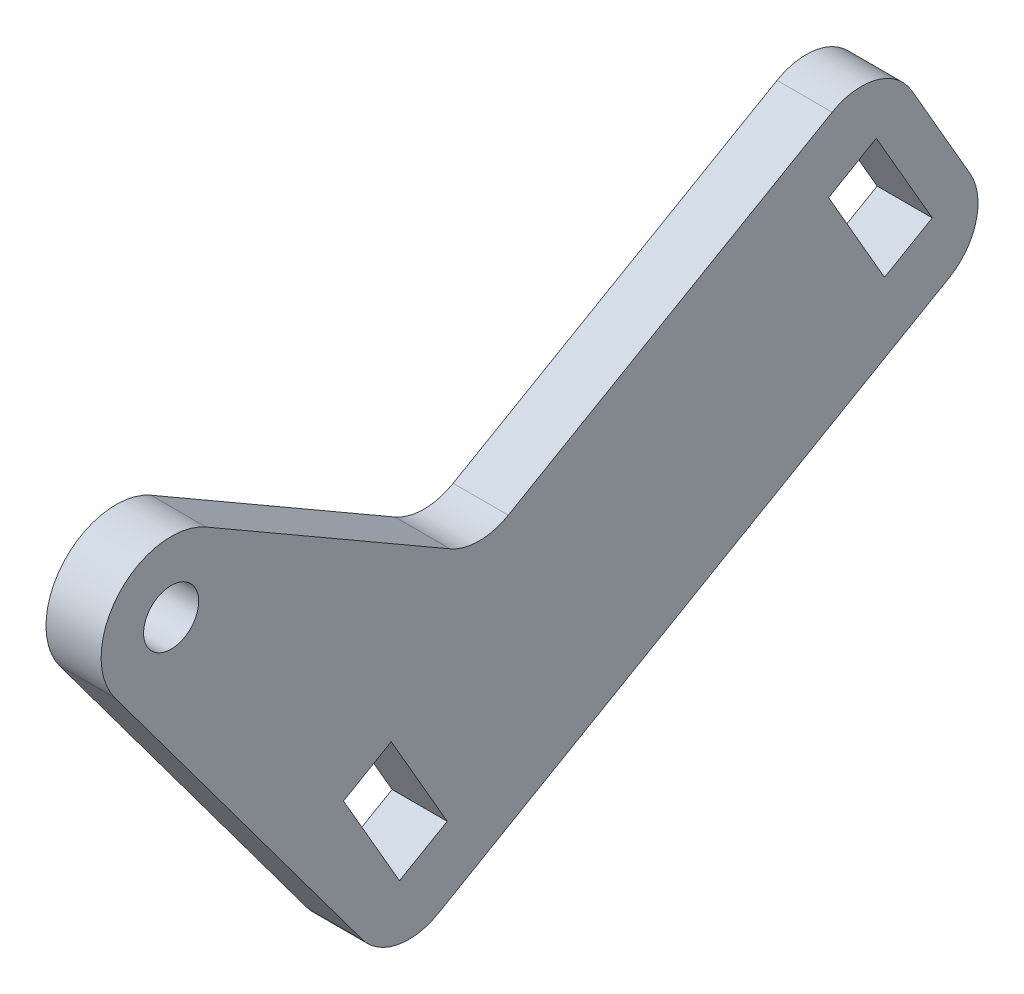
ISO-10303-21;
HEADER;
FILE_DESCRIPTION(('STEP AP214'),'2;1');
FILE_NAME('part.step','',(''),(''),'','','');
FILE_SCHEMA(('AUTOMOTIVE_DESIGN { 1 0 10303 214 1 1 1 1 }'));
ENDSEC;
DATA;
#1=APPLICATION_CONTEXT('core data for automotive mechanical design processes');
#2=APPLICATION_PROTOCOL_DEFINITION('international standard','automotive_design',2000,#1);
#3=PRODUCT_CONTEXT('',#1,'mechanical');
#4=PRODUCT('Part','Part','',(#3));
#5=PRODUCT_RELATED_PRODUCT_CATEGORY('part','',(#4));
#6=PRODUCT_DEFINITION_FORMATION('','',#4);
#7=PRODUCT_DEFINITION_CONTEXT('part definition',#1,'design');
#8=PRODUCT_DEFINITION('design','',#6,#7);
#9=PRODUCT_DEFINITION_SHAPE('','',#8);
#10=(LENGTH_UNIT() NAMED_UNIT(*) SI_UNIT(.MILLI.,.METRE.));
#11=(NAMED_UNIT(*) PLANE_ANGLE_UNIT() SI_UNIT($,.RADIAN.));
#12=(NAMED_UNIT(*) SI_UNIT($,.STERADIAN.) SOLID_ANGLE_UNIT());
#13=UNCERTAINTY_MEASURE_WITH_UNIT(LENGTH_MEASURE(1.E-05),#10,'distance_accuracy_value','');
#14=(GEOMETRIC_REPRESENTATION_CONTEXT(3) GLOBAL_UNCERTAINTY_ASSIGNED_CONTEXT((#13)) GLOBAL_UNIT_ASSIGNED_CONTEXT((#10,
#11,#12)) REPRESENTATION_CONTEXT('',''));
#15=CARTESIAN_POINT('',(0.,0.,0.));
#16=DIRECTION('',(0.,0.,1.));
#17=DIRECTION('',(1.,0.,0.));
#18=AXIS2_PLACEMENT_3D('',#15,#16,#17);
#19=CARTESIAN_POINT('',(1.499997,-4.02573868596873,19.6727839420936));
#20=DIRECTION('',(0.,-0.866025403784438,-0.500000000000001));
#21=DIRECTION('',(0.,0.500000000000001,-0.866025403784438));
#22=AXIS2_PLACEMENT_3D('',#19,#20,#21);
#23=PLANE('',#22);
#24=DIRECTION('',(0.,-0.500000000000001,0.866025403784438));
#25=VECTOR('',#24,1.);
#26=CARTESIAN_POINT('',(-1.499997,-4.02573868596873,19.6727839420936));
#27=LINE('',#26,#25);
#28=CARTESIAN_POINT('',(-1.499997,13.4367613140313,-10.5731532850779));
#29=VERTEX_POINT('',#28);
#30=CARTESIAN_POINT('',(-1.499997,3.26007386859692,7.0533864231627));
#31=VERTEX_POINT('',#30);
#32=EDGE_CURVE('E301',#29,#31,#27,.T.);
#33=ORIENTED_EDGE('',*,*,#32,.T.);
#34=DIRECTION('',(1.,0.,0.));
#35=VECTOR('',#34,1.);
#36=CARTESIAN_POINT('',(1.499997,3.26007386859692,7.0533864231627));
#37=LINE('',#36,#35);
#38=CARTESIAN_POINT('',(1.499997,3.26007386859692,7.0533864231627));
#39=VERTEX_POINT('',#38);
#40=EDGE_CURVE('E334',#31,#39,#37,.T.);
#41=ORIENTED_EDGE('',*,*,#40,.T.);
#42=DIRECTION('',(0.,-0.500000000000001,0.866025403784438));
#43=VECTOR('',#42,1.);
#44=CARTESIAN_POINT('',(1.499997,-4.02573868596873,19.6727839420936));
#45=LINE('',#44,#43);
#46=CARTESIAN_POINT('',(1.499997,13.4367613140313,-10.5731532850779));
#47=VERTEX_POINT('',#46);
#48=EDGE_CURVE('E304',#47,#39,#45,.T.);
#49=ORIENTED_EDGE('',*,*,#48,.F.);
#50=DIRECTION('',(-1.,0.,0.));
#51=VECTOR('',#50,1.);
#52=CARTESIAN_POINT('',(1.499997,13.4367613140313,-10.5731532850779));
#53=LINE('',#52,#51);
#54=EDGE_CURVE('E337',#47,#29,#53,.T.);
#55=ORIENTED_EDGE('',*,*,#54,.T.);
#56=EDGE_LOOP('',(#33,#41,#49,#55));
#57=FACE_BOUND('',#56,.T.);
#58=ADVANCED_FACE('F48',(#57),#23,.F.);
#59=CARTESIAN_POINT('',(1.499997,0.,0.));
#60=DIRECTION('',(-1.,0.,0.));
#61=DIRECTION('',(0.,0.,1.));
#62=AXIS2_PLACEMENT_3D('',#59,#60,#61);
#63=PLANE('',#62);
#64=DIRECTION('',(0.,0.866025403784438,0.500000000000001));
#65=VECTOR('',#64,1.);
#66=CARTESIAN_POINT('',(1.499997,15.0242613140313,-13.3227839420935));
#67=LINE('',#66,#65);
#68=CARTESIAN_POINT('',(1.499997,6.77536934298453,-18.0852839420935));
#69=VERTEX_POINT('',#68);
#70=CARTESIAN_POINT('',(1.499997,12.2746306570157,-14.9102839420935));
#71=VERTEX_POINT('',#70);
#72=EDGE_CURVE('E300',#69,#71,#67,.T.);
#73=ORIENTED_EDGE('',*,*,#72,.T.);
#74=CARTESIAN_POINT('',(1.499997,10.6871306570157,-12.1606532850779));
#75=DIRECTION('',(-1.,0.,0.));
#76=DIRECTION('',(0.,0.,1.));
#77=AXIS2_PLACEMENT_3D('',#74,#75,#76);
#78=CIRCLE('',#77,3.175);
#79=EDGE_CURVE('E316',#71,#47,#78,.F.);
#80=ORIENTED_EDGE('',*,*,#79,.T.);
#81=ORIENTED_EDGE('',*,*,#48,.T.);
#82=CARTESIAN_POINT('',(1.499997,6.00970452561251,8.6408864231627));
#83=DIRECTION('',(-1.,0.,0.));
#84=DIRECTION('',(0.,0.,1.));
#85=AXIS2_PLACEMENT_3D('',#82,#83,#84);
#86=CIRCLE('',#85,3.175);
#87=CARTESIAN_POINT('',(1.499997,3.26007386859693,10.2283864231627));
#88=VERTEX_POINT('',#87);
#89=EDGE_CURVE('E56',#39,#88,#86,.T.);
#90=ORIENTED_EDGE('',*,*,#89,.T.);
#91=DIRECTION('',(0.,-0.500000000000001,-0.866025403784438));
#92=VECTOR('',#91,1.);
#93=CARTESIAN_POINT('',(1.499997,-1.98396583964369,1.14544321158131));
#94=LINE('',#93,#92);
#95=CARTESIAN_POINT('',(1.499997,10.9195567884187,23.495));
#96=VERTEX_POINT('',#95);
#97=EDGE_CURVE('E183',#96,#88,#94,.T.);
#98=ORIENTED_EDGE('',*,*,#97,.F.);
#99=CARTESIAN_POINT('',(1.499997,7.62,25.4));
#100=DIRECTION('',(1.,0.,0.));
#101=DIRECTION('',(0.,0.,-1.));
#102=AXIS2_PLACEMENT_3D('',#99,#100,#101);
#103=CIRCLE('',#102,3.81);
#104=CARTESIAN_POINT('',(1.499997,5.34781342180019,28.4583113238924));
#105=VERTEX_POINT('',#104);
#106=EDGE_CURVE('E189',#96,#105,#103,.T.);
#107=ORIENTED_EDGE('',*,*,#106,.T.);
#108=DIRECTION('',(0.,0.802706384223733,0.596374429973704));
#109=VECTOR('',#108,1.);
#110=CARTESIAN_POINT('',(1.499997,-11.7213631105873,15.7766874765034));
#111=LINE('',#110,#109);
#112=CARTESIAN_POINT('',(1.499997,-12.7539738074901,15.0095045714544));
#113=VERTEX_POINT('',#112);
#114=EDGE_CURVE('E173',#113,#105,#111,.T.);
#115=ORIENTED_EDGE('',*,*,#114,.F.);
#116=CARTESIAN_POINT('',(1.499997,-10.8604849923236,12.460911801544));
#117=DIRECTION('',(-1.,0.,0.));
#118=DIRECTION('',(0.,0.,1.));
#119=AXIS2_PLACEMENT_3D('',#116,#117,#118);
#120=CIRCLE('',#119,3.175);
#121=CARTESIAN_POINT('',(1.499997,-13.6101156493392,10.873411801544));
#122=VERTEX_POINT('',#121);
#123=EDGE_CURVE('E70',#113,#122,#120,.F.);
#124=ORIENTED_EDGE('',*,*,#123,.T.);
#125=DIRECTION('',(0.,0.500000000000001,-0.866025403784438));
#126=VECTOR('',#125,1.);
#127=CARTESIAN_POINT('',(1.499997,4.02573868596894,-19.6727839420935));
#128=LINE('',#127,#126);
#129=CARTESIAN_POINT('',(1.499997,2.43823868596893,-16.9231532850779));
#130=VERTEX_POINT('',#129);
#131=EDGE_CURVE('E297',#122,#130,#128,.T.);
#132=ORIENTED_EDGE('',*,*,#131,.T.);
#133=CARTESIAN_POINT('',(1.499997,5.18786934298452,-15.3356532850779));
#134=DIRECTION('',(-1.,0.,0.));
#135=DIRECTION('',(0.,0.,1.));
#136=AXIS2_PLACEMENT_3D('',#133,#134,#135);
#137=CIRCLE('',#136,3.175);
#138=EDGE_CURVE('E318',#130,#69,#137,.F.);
#139=ORIENTED_EDGE('',*,*,#138,.T.);
#140=EDGE_LOOP('',(#73,#80,#81,#90,#98,#107,#115,#124,#132,#139));
#141=FACE_BOUND('',#140,.T.);
#142=DIRECTION('',(0.,-0.5,0.866025403784439));
#143=VECTOR('',#142,1.);
#144=CARTESIAN_POINT('',(1.499997,-5.73035456926496,16.0212652593516));
#145=LINE('',#144,#143);
#146=CARTESIAN_POINT('',(1.499997,-4.23035456926496,13.4231890479982));
#147=VERTEX_POINT('',#146);
#148=CARTESIAN_POINT('',(1.499997,-5.73035456926496,16.0212652593516));
#149=VERTEX_POINT('',#148);
#150=EDGE_CURVE('E264',#147,#149,#145,.T.);
#151=ORIENTED_EDGE('',*,*,#150,.F.);
#152=DIRECTION('',(0.,0.866025403784439,0.5));
#153=VECTOR('',#152,1.);
#154=CARTESIAN_POINT('',(1.499997,-4.23035456926496,13.4231890479982));
#155=LINE('',#154,#153);
#156=CARTESIAN_POINT('',(1.499997,-9.5096454307349,10.3751890479982));
#157=VERTEX_POINT('',#156);
#158=EDGE_CURVE('E272',#157,#147,#155,.T.);
#159=ORIENTED_EDGE('',*,*,#158,.F.);
#160=DIRECTION('',(0.,0.5,-0.866025403784439));
#161=VECTOR('',#160,1.);
#162=CARTESIAN_POINT('',(1.499997,-11.0096454307349,12.9732652593516));
#163=LINE('',#162,#161);
#164=CARTESIAN_POINT('',(1.499997,-11.0096454307349,12.9732652593516));
#165=VERTEX_POINT('',#164);
#166=EDGE_CURVE('E276',#165,#157,#163,.T.);
#167=ORIENTED_EDGE('',*,*,#166,.F.);
#168=DIRECTION('',(0.,-0.866025403784439,-0.5));
#169=VECTOR('',#168,1.);
#170=CARTESIAN_POINT('',(1.499997,-5.73035456926496,16.0212652593516));
#171=LINE('',#170,#169);
#172=EDGE_CURVE('E266',#149,#165,#171,.T.);
#173=ORIENTED_EDGE('',*,*,#172,.F.);
#174=EDGE_LOOP('',(#151,#159,#167,#173));
#175=FACE_BOUND('',#174,.T.);
#176=DIRECTION('',(0.,-0.500000000000001,0.866025403784438));
#177=VECTOR('',#176,1.);
#178=CARTESIAN_POINT('',(1.499997,9.5096454307349,-10.3751890479982));
#179=LINE('',#178,#177);
#180=CARTESIAN_POINT('',(1.499997,11.0096454307349,-12.9732652593515));
#181=VERTEX_POINT('',#180);
#182=CARTESIAN_POINT('',(1.499997,9.5096454307349,-10.3751890479982));
#183=VERTEX_POINT('',#182);
#184=EDGE_CURVE('E224',#181,#183,#179,.T.);
#185=ORIENTED_EDGE('',*,*,#184,.F.);
#186=DIRECTION('',(0.,0.866025403784438,0.5));
#187=VECTOR('',#186,1.);
#188=CARTESIAN_POINT('',(1.499997,11.0096454307349,-12.9732652593515));
#189=LINE('',#188,#187);
#190=CARTESIAN_POINT('',(1.499997,5.73035456926497,-16.0212652593515));
#191=VERTEX_POINT('',#190);
#192=EDGE_CURVE('E238',#191,#181,#189,.T.);
#193=ORIENTED_EDGE('',*,*,#192,.F.);
#194=DIRECTION('',(0.,0.5,-0.866025403784439));
#195=VECTOR('',#194,1.);
#196=CARTESIAN_POINT('',(1.499997,4.23035456926497,-13.4231890479982));
#197=LINE('',#196,#195);
#198=CARTESIAN_POINT('',(1.499997,4.23035456926497,-13.4231890479982));
#199=VERTEX_POINT('',#198);
#200=EDGE_CURVE('E242',#199,#191,#197,.T.);
#201=ORIENTED_EDGE('',*,*,#200,.F.);
#202=DIRECTION('',(0.,-0.866025403784439,-0.5));
#203=VECTOR('',#202,1.);
#204=CARTESIAN_POINT('',(1.499997,9.5096454307349,-10.3751890479982));
#205=LINE('',#204,#203);
#206=EDGE_CURVE('E227',#183,#199,#205,.T.);
#207=ORIENTED_EDGE('',*,*,#206,.F.);
#208=EDGE_LOOP('',(#185,#193,#201,#207));
#209=FACE_BOUND('',#208,.T.);
#210=CARTESIAN_POINT('',(1.499997,7.62,25.4));
#211=DIRECTION('',(1.,0.,0.));
#212=DIRECTION('',(0.,0.,-1.));
#213=AXIS2_PLACEMENT_3D('',#210,#211,#212);
#214=CIRCLE('',#213,1.5);
#215=CARTESIAN_POINT('',(1.499997,7.62,23.9));
#216=VERTEX_POINT('',#215);
#217=EDGE_CURVE('E199',#216,#216,#214,.T.);
#218=ORIENTED_EDGE('',*,*,#217,.F.);
#219=EDGE_LOOP('',(#218));
#220=FACE_BOUND('',#219,.T.);
#221=ADVANCED_FACE('F196',(#141,#175,#209,#220),#63,.F.);
#222=CARTESIAN_POINT('',(-1.499997,0.,0.));
#223=DIRECTION('',(-1.,0.,0.));
#224=DIRECTION('',(0.,0.,1.));
#225=AXIS2_PLACEMENT_3D('',#222,#223,#224);
#226=PLANE('',#225);
#227=ORIENTED_EDGE('',*,*,#32,.F.);
#228=CARTESIAN_POINT('',(-1.499997,10.6871306570157,-12.1606532850779));
#229=DIRECTION('',(-1.,0.,0.));
#230=DIRECTION('',(0.,0.,1.));
#231=AXIS2_PLACEMENT_3D('',#228,#229,#230);
#232=CIRCLE('',#231,3.175);
#233=CARTESIAN_POINT('',(-1.499997,12.2746306570157,-14.9102839420935));
#234=VERTEX_POINT('',#233);
#235=EDGE_CURVE('E326',#29,#234,#232,.T.);
#236=ORIENTED_EDGE('',*,*,#235,.T.);
#237=DIRECTION('',(0.,0.866025403784438,0.500000000000001));
#238=VECTOR('',#237,1.);
#239=CARTESIAN_POINT('',(-1.499997,15.0242613140313,-13.3227839420935));
#240=LINE('',#239,#238);
#241=CARTESIAN_POINT('',(-1.499997,6.77536934298453,-18.0852839420935));
#242=VERTEX_POINT('',#241);
#243=EDGE_CURVE('E342',#242,#234,#240,.T.);
#244=ORIENTED_EDGE('',*,*,#243,.F.);
#245=CARTESIAN_POINT('',(-1.499997,5.18786934298452,-15.3356532850779));
#246=DIRECTION('',(-1.,0.,0.));
#247=DIRECTION('',(0.,0.,1.));
#248=AXIS2_PLACEMENT_3D('',#245,#246,#247);
#249=CIRCLE('',#248,3.175);
#250=CARTESIAN_POINT('',(-1.499997,2.43823868596893,-16.9231532850779));
#251=VERTEX_POINT('',#250);
#252=EDGE_CURVE('E328',#242,#251,#249,.T.);
#253=ORIENTED_EDGE('',*,*,#252,.T.);
#254=DIRECTION('',(0.,0.500000000000001,-0.866025403784438));
#255=VECTOR('',#254,1.);
#256=CARTESIAN_POINT('',(-1.499997,4.02573868596894,-19.6727839420935));
#257=LINE('',#256,#255);
#258=CARTESIAN_POINT('',(-1.499997,-13.6101156493392,10.873411801544));
#259=VERTEX_POINT('',#258);
#260=EDGE_CURVE('E296',#259,#251,#257,.T.);
#261=ORIENTED_EDGE('',*,*,#260,.F.);
#262=CARTESIAN_POINT('',(-1.499997,-10.8604849923236,12.460911801544));
#263=DIRECTION('',(-1.,0.,0.));
#264=DIRECTION('',(0.,0.,1.));
#265=AXIS2_PLACEMENT_3D('',#262,#263,#264);
#266=CIRCLE('',#265,3.175);
#267=CARTESIAN_POINT('',(-1.499997,-12.7539738074901,15.0095045714544));
#268=VERTEX_POINT('',#267);
#269=EDGE_CURVE('E330',#259,#268,#266,.T.);
#270=ORIENTED_EDGE('',*,*,#269,.T.);
#271=DIRECTION('',(0.,0.802706384223733,0.596374429973704));
#272=VECTOR('',#271,1.);
#273=CARTESIAN_POINT('',(-1.499997,-11.7213631105873,15.7766874765034));
#274=LINE('',#273,#272);
#275=CARTESIAN_POINT('',(-1.499997,5.34781342180019,28.4583113238924));
#276=VERTEX_POINT('',#275);
#277=EDGE_CURVE('E182',#268,#276,#274,.T.);
#278=ORIENTED_EDGE('',*,*,#277,.T.);
#279=CARTESIAN_POINT('',(-1.499997,7.62,25.4));
#280=DIRECTION('',(1.,0.,0.));
#281=DIRECTION('',(0.,0.,-1.));
#282=AXIS2_PLACEMENT_3D('',#279,#280,#281);
#283=CIRCLE('',#282,3.81);
#284=CARTESIAN_POINT('',(-1.499997,10.9195567884187,23.495));
#285=VERTEX_POINT('',#284);
#286=EDGE_CURVE('E191',#285,#276,#283,.T.);
#287=ORIENTED_EDGE('',*,*,#286,.F.);
#288=DIRECTION('',(0.,-0.500000000000001,-0.866025403784438));
#289=VECTOR('',#288,1.);
#290=CARTESIAN_POINT('',(-1.499997,-1.98396583964369,1.14544321158131));
#291=LINE('',#290,#289);
#292=CARTESIAN_POINT('',(-1.499997,3.26007386859693,10.2283864231627));
#293=VERTEX_POINT('',#292);
#294=EDGE_CURVE('E218',#285,#293,#291,.T.);
#295=ORIENTED_EDGE('',*,*,#294,.T.);
#296=CARTESIAN_POINT('',(-1.499997,6.00970452561251,8.6408864231627));
#297=DIRECTION('',(-1.,0.,0.));
#298=DIRECTION('',(0.,0.,1.));
#299=AXIS2_PLACEMENT_3D('',#296,#297,#298);
#300=CIRCLE('',#299,3.175);
#301=EDGE_CURVE('E12',#293,#31,#300,.F.);
#302=ORIENTED_EDGE('',*,*,#301,.T.);
#303=EDGE_LOOP('',(#227,#236,#244,#253,#261,#270,#278,#287,#295,#302));
#304=FACE_BOUND('',#303,.T.);
#305=DIRECTION('',(0.,0.866025403784439,0.5));
#306=VECTOR('',#305,1.);
#307=CARTESIAN_POINT('',(-1.499997,-4.23035456926496,13.4231890479982));
#308=LINE('',#307,#306);
#309=CARTESIAN_POINT('',(-1.499997,-9.5096454307349,10.3751890479982));
#310=VERTEX_POINT('',#309);
#311=CARTESIAN_POINT('',(-1.499997,-4.23035456926496,13.4231890479982));
#312=VERTEX_POINT('',#311);
#313=EDGE_CURVE('E267',#310,#312,#308,.T.);
#314=ORIENTED_EDGE('',*,*,#313,.T.);
#315=DIRECTION('',(0.,-0.5,0.866025403784439));
#316=VECTOR('',#315,1.);
#317=CARTESIAN_POINT('',(-1.499997,-5.73035456926496,16.0212652593516));
#318=LINE('',#317,#316);
#319=CARTESIAN_POINT('',(-1.499997,-5.73035456926496,16.0212652593516));
#320=VERTEX_POINT('',#319);
#321=EDGE_CURVE('E263',#312,#320,#318,.T.);
#322=ORIENTED_EDGE('',*,*,#321,.T.);
#323=DIRECTION('',(0.,-0.866025403784439,-0.5));
#324=VECTOR('',#323,1.);
#325=CARTESIAN_POINT('',(-1.499997,-5.73035456926496,16.0212652593516));
#326=LINE('',#325,#324);
#327=CARTESIAN_POINT('',(-1.499997,-11.0096454307349,12.9732652593516));
#328=VERTEX_POINT('',#327);
#329=EDGE_CURVE('E280',#320,#328,#326,.T.);
#330=ORIENTED_EDGE('',*,*,#329,.T.);
#331=DIRECTION('',(0.,0.5,-0.866025403784439));
#332=VECTOR('',#331,1.);
#333=CARTESIAN_POINT('',(-1.499997,-11.0096454307349,12.9732652593516));
#334=LINE('',#333,#332);
#335=EDGE_CURVE('E283',#328,#310,#334,.T.);
#336=ORIENTED_EDGE('',*,*,#335,.T.);
#337=EDGE_LOOP('',(#314,#322,#330,#336));
#338=FACE_BOUND('',#337,.T.);
#339=DIRECTION('',(0.,0.866025403784438,0.5));
#340=VECTOR('',#339,1.);
#341=CARTESIAN_POINT('',(-1.499997,11.0096454307349,-12.9732652593515));
#342=LINE('',#341,#340);
#343=CARTESIAN_POINT('',(-1.499997,5.73035456926497,-16.0212652593516));
#344=VERTEX_POINT('',#343);
#345=CARTESIAN_POINT('',(-1.499997,11.0096454307349,-12.9732652593515));
#346=VERTEX_POINT('',#345);
#347=EDGE_CURVE('E228',#344,#346,#342,.T.);
#348=ORIENTED_EDGE('',*,*,#347,.T.);
#349=DIRECTION('',(0.,-0.500000000000001,0.866025403784438));
#350=VECTOR('',#349,1.);
#351=CARTESIAN_POINT('',(-1.499997,9.5096454307349,-10.3751890479982));
#352=LINE('',#351,#350);
#353=CARTESIAN_POINT('',(-1.499997,9.5096454307349,-10.3751890479982));
#354=VERTEX_POINT('',#353);
#355=EDGE_CURVE('E221',#346,#354,#352,.T.);
#356=ORIENTED_EDGE('',*,*,#355,.T.);
#357=DIRECTION('',(0.,-0.866025403784439,-0.5));
#358=VECTOR('',#357,1.);
#359=CARTESIAN_POINT('',(-1.499997,9.5096454307349,-10.3751890479982));
#360=LINE('',#359,#358);
#361=CARTESIAN_POINT('',(-1.499997,4.23035456926497,-13.4231890479982));
#362=VERTEX_POINT('',#361);
#363=EDGE_CURVE('E246',#354,#362,#360,.T.);
#364=ORIENTED_EDGE('',*,*,#363,.T.);
#365=DIRECTION('',(0.,0.5,-0.866025403784439));
#366=VECTOR('',#365,1.);
#367=CARTESIAN_POINT('',(-1.499997,4.23035456926497,-13.4231890479982));
#368=LINE('',#367,#366);
#369=EDGE_CURVE('E249',#362,#344,#368,.T.);
#370=ORIENTED_EDGE('',*,*,#369,.T.);
#371=EDGE_LOOP('',(#348,#356,#364,#370));
#372=FACE_BOUND('',#371,.T.);
#373=CARTESIAN_POINT('',(-1.499997,7.62,25.4));
#374=DIRECTION('',(1.,0.,0.));
#375=DIRECTION('',(0.,0.,-1.));
#376=AXIS2_PLACEMENT_3D('',#373,#374,#375);
#377=CIRCLE('',#376,1.5);
#378=CARTESIAN_POINT('',(-1.499997,7.62,23.9));
#379=VERTEX_POINT('',#378);
#380=EDGE_CURVE('E205',#379,#379,#377,.T.);
#381=ORIENTED_EDGE('',*,*,#380,.T.);
#382=EDGE_LOOP('',(#381));
#383=FACE_BOUND('',#382,.T.);
#384=ADVANCED_FACE('F372',(#304,#338,#372,#383),#226,.T.);
#385=CARTESIAN_POINT('',(1.499997,4.02573868596894,-19.6727839420935));
#386=DIRECTION('',(0.,0.866025403784438,0.500000000000001));
#387=DIRECTION('',(0.,-0.500000000000001,0.866025403784438));
#388=AXIS2_PLACEMENT_3D('',#385,#386,#387);
#389=PLANE('',#388);
#390=ORIENTED_EDGE('',*,*,#260,.T.);
#391=DIRECTION('',(-1.,0.,0.));
#392=VECTOR('',#391,1.);
#393=CARTESIAN_POINT('',(1.499997,2.43823868596893,-16.9231532850779));
#394=LINE('',#393,#392);
#395=EDGE_CURVE('E63',#251,#130,#394,.F.);
#396=ORIENTED_EDGE('',*,*,#395,.T.);
#397=ORIENTED_EDGE('',*,*,#131,.F.);
#398=DIRECTION('',(-1.,0.,0.));
#399=VECTOR('',#398,1.);
#400=CARTESIAN_POINT('',(1.499997,-13.6101156493392,10.873411801544));
#401=LINE('',#400,#399);
#402=EDGE_CURVE('E313',#122,#259,#401,.T.);
#403=ORIENTED_EDGE('',*,*,#402,.T.);
#404=EDGE_LOOP('',(#390,#396,#397,#403));
#405=FACE_BOUND('',#404,.T.);
#406=ADVANCED_FACE('F345',(#405),#389,.F.);
#407=CARTESIAN_POINT('',(1.499997,15.0242613140313,-13.3227839420935));
#408=DIRECTION('',(0.,-0.500000000000001,0.866025403784438));
#409=DIRECTION('',(0.,-0.866025403784438,-0.500000000000001));
#410=AXIS2_PLACEMENT_3D('',#407,#408,#409);
#411=PLANE('',#410);
#412=ORIENTED_EDGE('',*,*,#243,.T.);
#413=DIRECTION('',(-1.,0.,0.));
#414=VECTOR('',#413,1.);
#415=CARTESIAN_POINT('',(1.499997,12.2746306570157,-14.9102839420935));
#416=LINE('',#415,#414);
#417=EDGE_CURVE('E321',#234,#71,#416,.F.);
#418=ORIENTED_EDGE('',*,*,#417,.T.);
#419=ORIENTED_EDGE('',*,*,#72,.F.);
#420=DIRECTION('',(-1.,0.,0.));
#421=VECTOR('',#420,1.);
#422=CARTESIAN_POINT('',(1.499997,6.77536934298453,-18.0852839420935));
#423=LINE('',#422,#421);
#424=EDGE_CURVE('E323',#69,#242,#423,.T.);
#425=ORIENTED_EDGE('',*,*,#424,.T.);
#426=EDGE_LOOP('',(#412,#418,#419,#425));
#427=FACE_BOUND('',#426,.T.);
#428=ADVANCED_FACE('F355',(#427),#411,.F.);
#429=CARTESIAN_POINT('',(1.499997,-5.73035456926496,16.0212652593516));
#430=DIRECTION('',(0.,-0.866025403784439,-0.5));
#431=DIRECTION('',(0.,0.5,-0.866025403784439));
#432=AXIS2_PLACEMENT_3D('',#429,#430,#431);
#433=PLANE('',#432);
#434=ORIENTED_EDGE('',*,*,#321,.F.);
#435=DIRECTION('',(-1.,0.,0.));
#436=VECTOR('',#435,1.);
#437=CARTESIAN_POINT('',(1.499997,-4.23035456926496,13.4231890479982));
#438=LINE('',#437,#436);
#439=EDGE_CURVE('E275',#147,#312,#438,.T.);
#440=ORIENTED_EDGE('',*,*,#439,.F.);
#441=ORIENTED_EDGE('',*,*,#150,.T.);
#442=DIRECTION('',(-1.,0.,0.));
#443=VECTOR('',#442,1.);
#444=CARTESIAN_POINT('',(1.499997,-5.73035456926496,16.0212652593516));
#445=LINE('',#444,#443);
#446=EDGE_CURVE('E294',#149,#320,#445,.T.);
#447=ORIENTED_EDGE('',*,*,#446,.T.);
#448=EDGE_LOOP('',(#434,#440,#441,#447));
#449=FACE_BOUND('',#448,.T.);
#450=ADVANCED_FACE('F399',(#449),#433,.T.);
#451=CARTESIAN_POINT('',(1.499997,-5.73035456926496,16.0212652593516));
#452=DIRECTION('',(0.,0.5,-0.866025403784439));
#453=DIRECTION('',(0.,0.866025403784439,0.5));
#454=AXIS2_PLACEMENT_3D('',#451,#452,#453);
#455=PLANE('',#454);
#456=ORIENTED_EDGE('',*,*,#329,.F.);
#457=ORIENTED_EDGE('',*,*,#446,.F.);
#458=ORIENTED_EDGE('',*,*,#172,.T.);
#459=DIRECTION('',(-1.,0.,0.));
#460=VECTOR('',#459,1.);
#461=CARTESIAN_POINT('',(1.499997,-11.0096454307349,12.9732652593516));
#462=LINE('',#461,#460);
#463=EDGE_CURVE('E292',#165,#328,#462,.T.);
#464=ORIENTED_EDGE('',*,*,#463,.T.);
#465=EDGE_LOOP('',(#456,#457,#458,#464));
#466=FACE_BOUND('',#465,.T.);
#467=ADVANCED_FACE('F495',(#466),#455,.T.);
#468=CARTESIAN_POINT('',(1.499997,-11.0096454307349,12.9732652593516));
#469=DIRECTION('',(0.,0.866025403784439,0.5));
#470=DIRECTION('',(0.,-0.5,0.866025403784439));
#471=AXIS2_PLACEMENT_3D('',#468,#469,#470);
#472=PLANE('',#471);
#473=ORIENTED_EDGE('',*,*,#335,.F.);
#474=ORIENTED_EDGE('',*,*,#463,.F.);
#475=ORIENTED_EDGE('',*,*,#166,.T.);
#476=DIRECTION('',(-1.,0.,0.));
#477=VECTOR('',#476,1.);
#478=CARTESIAN_POINT('',(1.499997,-9.5096454307349,10.3751890479982));
#479=LINE('',#478,#477);
#480=EDGE_CURVE('E290',#157,#310,#479,.T.);
#481=ORIENTED_EDGE('',*,*,#480,.T.);
#482=EDGE_LOOP('',(#473,#474,#475,#481));
#483=FACE_BOUND('',#482,.T.);
#484=ADVANCED_FACE('F505',(#483),#472,.T.);
#485=CARTESIAN_POINT('',(1.499997,-4.23035456926496,13.4231890479982));
#486=DIRECTION('',(0.,-0.5,0.866025403784439));
#487=DIRECTION('',(0.,-0.866025403784439,-0.5));
#488=AXIS2_PLACEMENT_3D('',#485,#486,#487);
#489=PLANE('',#488);
#490=ORIENTED_EDGE('',*,*,#313,.F.);
#491=ORIENTED_EDGE('',*,*,#480,.F.);
#492=ORIENTED_EDGE('',*,*,#158,.T.);
#493=ORIENTED_EDGE('',*,*,#439,.T.);
#494=EDGE_LOOP('',(#490,#491,#492,#493));
#495=FACE_BOUND('',#494,.T.);
#496=ADVANCED_FACE('F515',(#495),#489,.T.);
#497=CARTESIAN_POINT('',(1.499997,9.5096454307349,-10.3751890479982));
#498=DIRECTION('',(0.,-0.866025403784438,-0.500000000000001));
#499=DIRECTION('',(0.,0.500000000000001,-0.866025403784438));
#500=AXIS2_PLACEMENT_3D('',#497,#498,#499);
#501=PLANE('',#500);
#502=ORIENTED_EDGE('',*,*,#355,.F.);
#503=DIRECTION('',(-1.,0.,0.));
#504=VECTOR('',#503,1.);
#505=CARTESIAN_POINT('',(1.499997,11.0096454307349,-12.9732652593515));
#506=LINE('',#505,#504);
#507=EDGE_CURVE('E241',#181,#346,#506,.T.);
#508=ORIENTED_EDGE('',*,*,#507,.F.);
#509=ORIENTED_EDGE('',*,*,#184,.T.);
#510=DIRECTION('',(-1.,0.,0.));
#511=VECTOR('',#510,1.);
#512=CARTESIAN_POINT('',(1.499997,9.5096454307349,-10.3751890479982));
#513=LINE('',#512,#511);
#514=EDGE_CURVE('E260',#183,#354,#513,.T.);
#515=ORIENTED_EDGE('',*,*,#514,.T.);
#516=EDGE_LOOP('',(#502,#508,#509,#515));
#517=FACE_BOUND('',#516,.T.);
#518=ADVANCED_FACE('F525',(#517),#501,.T.);
#519=CARTESIAN_POINT('',(1.499997,9.5096454307349,-10.3751890479982));
#520=DIRECTION('',(0.,0.5,-0.866025403784439));
#521=DIRECTION('',(0.,0.866025403784439,0.5));
#522=AXIS2_PLACEMENT_3D('',#519,#520,#521);
#523=PLANE('',#522);
#524=ORIENTED_EDGE('',*,*,#363,.F.);
#525=ORIENTED_EDGE('',*,*,#514,.F.);
#526=ORIENTED_EDGE('',*,*,#206,.T.);
#527=DIRECTION('',(-1.,0.,0.));
#528=VECTOR('',#527,1.);
#529=CARTESIAN_POINT('',(1.499997,4.23035456926497,-13.4231890479982));
#530=LINE('',#529,#528);
#531=EDGE_CURVE('E258',#199,#362,#530,.T.);
#532=ORIENTED_EDGE('',*,*,#531,.T.);
#533=EDGE_LOOP('',(#524,#525,#526,#532));
#534=FACE_BOUND('',#533,.T.);
#535=ADVANCED_FACE('F535',(#534),#523,.T.);
#536=CARTESIAN_POINT('',(1.499997,4.23035456926497,-13.4231890479982));
#537=DIRECTION('',(0.,0.866025403784439,0.5));
#538=DIRECTION('',(0.,-0.5,0.866025403784439));
#539=AXIS2_PLACEMENT_3D('',#536,#537,#538);
#540=PLANE('',#539);
#541=ORIENTED_EDGE('',*,*,#369,.F.);
#542=ORIENTED_EDGE('',*,*,#531,.F.);
#543=ORIENTED_EDGE('',*,*,#200,.T.);
#544=DIRECTION('',(-1.,0.,0.));
#545=VECTOR('',#544,1.);
#546=CARTESIAN_POINT('',(1.499997,5.73035456926497,-16.0212652593516));
#547=LINE('',#546,#545);
#548=EDGE_CURVE('E256',#191,#344,#547,.T.);
#549=ORIENTED_EDGE('',*,*,#548,.T.);
#550=EDGE_LOOP('',(#541,#542,#543,#549));
#551=FACE_BOUND('',#550,.T.);
#552=ADVANCED_FACE('F545',(#551),#540,.T.);
#553=CARTESIAN_POINT('',(1.499997,11.0096454307349,-12.9732652593515));
#554=DIRECTION('',(0.,-0.5,0.866025403784438));
#555=DIRECTION('',(0.,-0.866025403784439,-0.5));
#556=AXIS2_PLACEMENT_3D('',#553,#554,#555);
#557=PLANE('',#556);
#558=ORIENTED_EDGE('',*,*,#347,.F.);
#559=ORIENTED_EDGE('',*,*,#548,.F.);
#560=ORIENTED_EDGE('',*,*,#192,.T.);
#561=ORIENTED_EDGE('',*,*,#507,.T.);
#562=EDGE_LOOP('',(#558,#559,#560,#561));
#563=FACE_BOUND('',#562,.T.);
#564=ADVANCED_FACE('F444',(#563),#557,.T.);
#565=CARTESIAN_POINT('',(-34.1467736774771,-1.98396583964369,1.14544321158131));
#566=DIRECTION('',(0.,-0.866025403784438,0.500000000000001));
#567=DIRECTION('',(0.,-0.500000000000001,-0.866025403784438));
#568=AXIS2_PLACEMENT_3D('',#565,#566,#567);
#569=PLANE('',#568);
#570=ORIENTED_EDGE('',*,*,#97,.T.);
#571=DIRECTION('',(1.,0.,0.));
#572=VECTOR('',#571,1.);
#573=CARTESIAN_POINT('',(-1.499997,3.26007386859693,10.2283864231627));
#574=LINE('',#573,#572);
#575=EDGE_CURVE('E332',#88,#293,#574,.F.);
#576=ORIENTED_EDGE('',*,*,#575,.T.);
#577=ORIENTED_EDGE('',*,*,#294,.F.);
#578=DIRECTION('',(1.,0.,0.));
#579=VECTOR('',#578,1.);
#580=CARTESIAN_POINT('',(-34.1467736774771,10.9195567884187,23.495));
#581=LINE('',#580,#579);
#582=EDGE_CURVE('E192',#285,#96,#581,.T.);
#583=ORIENTED_EDGE('',*,*,#582,.T.);
#584=EDGE_LOOP('',(#570,#576,#577,#583));
#585=FACE_BOUND('',#584,.T.);
#586=ADVANCED_FACE('F371',(#585),#569,.F.);
#587=CARTESIAN_POINT('',(-34.1467736774771,-11.7213631105873,15.7766874765034));
#588=DIRECTION('',(0.,0.596374429973704,-0.802706384223733));
#589=DIRECTION('',(0.,0.802706384223733,0.596374429973704));
#590=AXIS2_PLACEMENT_3D('',#587,#588,#589);
#591=PLANE('',#590);
#592=ORIENTED_EDGE('',*,*,#277,.F.);
#593=DIRECTION('',(-1.,0.,0.));
#594=VECTOR('',#593,1.);
#595=CARTESIAN_POINT('',(-34.1467736774771,-12.7539738074901,15.0095045714544));
#596=LINE('',#595,#594);
#597=EDGE_CURVE('E180',#268,#113,#596,.F.);
#598=ORIENTED_EDGE('',*,*,#597,.T.);
#599=ORIENTED_EDGE('',*,*,#114,.T.);
#600=DIRECTION('',(1.,0.,0.));
#601=VECTOR('',#600,1.);
#602=CARTESIAN_POINT('',(-34.1467736774771,5.34781342180019,28.4583113238924));
#603=LINE('',#602,#601);
#604=EDGE_CURVE('E177',#276,#105,#603,.T.);
#605=ORIENTED_EDGE('',*,*,#604,.F.);
#606=EDGE_LOOP('',(#592,#598,#599,#605));
#607=FACE_BOUND('',#606,.T.);
#608=ADVANCED_FACE('F176',(#607),#591,.F.);
#609=CARTESIAN_POINT('',(1.499997,7.62,25.4));
#610=DIRECTION('',(-1.,0.,0.));
#611=DIRECTION('',(0.,0.,1.));
#612=AXIS2_PLACEMENT_3D('',#609,#610,#611);
#613=CYLINDRICAL_SURFACE('',#612,1.5);
#614=ORIENTED_EDGE('',*,*,#217,.T.);
#615=EDGE_LOOP('',(#614));
#616=FACE_BOUND('',#615,.T.);
#617=ORIENTED_EDGE('',*,*,#380,.F.);
#618=EDGE_LOOP('',(#617));
#619=FACE_BOUND('',#618,.T.);
#620=ADVANCED_FACE('F378',(#616,#619),#613,.F.);
#621=CARTESIAN_POINT('',(1.499997,7.62,25.4));
#622=DIRECTION('',(-1.,0.,0.));
#623=DIRECTION('',(0.,0.,1.));
#624=AXIS2_PLACEMENT_3D('',#621,#622,#623);
#625=CYLINDRICAL_SURFACE('',#624,3.81);
#626=ORIENTED_EDGE('',*,*,#582,.F.);
#627=ORIENTED_EDGE('',*,*,#286,.T.);
#628=ORIENTED_EDGE('',*,*,#604,.T.);
#629=ORIENTED_EDGE('',*,*,#106,.F.);
#630=EDGE_LOOP('',(#626,#627,#628,#629));
#631=FACE_BOUND('',#630,.T.);
#632=ADVANCED_FACE('F188',(#631),#625,.T.);
#633=CARTESIAN_POINT('',(1.499997,6.00970452561251,8.6408864231627));
#634=DIRECTION('',(-1.,0.,0.));
#635=DIRECTION('',(0.,0.,1.));
#636=AXIS2_PLACEMENT_3D('',#633,#634,#635);
#637=CYLINDRICAL_SURFACE('',#636,3.175);
#638=ORIENTED_EDGE('',*,*,#301,.F.);
#639=ORIENTED_EDGE('',*,*,#575,.F.);
#640=ORIENTED_EDGE('',*,*,#89,.F.);
#641=ORIENTED_EDGE('',*,*,#40,.F.);
#642=EDGE_LOOP('',(#638,#639,#640,#641));
#643=FACE_BOUND('',#642,.T.);
#644=ADVANCED_FACE('F368',(#643),#637,.F.);
#645=CARTESIAN_POINT('',(1.499997,10.6871306570157,-12.1606532850779));
#646=DIRECTION('',(-1.,0.,0.));
#647=DIRECTION('',(0.,0.,1.));
#648=AXIS2_PLACEMENT_3D('',#645,#646,#647);
#649=CYLINDRICAL_SURFACE('',#648,3.175);
#650=ORIENTED_EDGE('',*,*,#79,.F.);
#651=ORIENTED_EDGE('',*,*,#417,.F.);
#652=ORIENTED_EDGE('',*,*,#235,.F.);
#653=ORIENTED_EDGE('',*,*,#54,.F.);
#654=EDGE_LOOP('',(#650,#651,#652,#653));
#655=FACE_BOUND('',#654,.T.);
#656=ADVANCED_FACE('F359',(#655),#649,.T.);
#657=CARTESIAN_POINT('',(1.499997,5.18786934298452,-15.3356532850779));
#658=DIRECTION('',(-1.,0.,0.));
#659=DIRECTION('',(0.,0.,1.));
#660=AXIS2_PLACEMENT_3D('',#657,#658,#659);
#661=CYLINDRICAL_SURFACE('',#660,3.175);
#662=ORIENTED_EDGE('',*,*,#138,.F.);
#663=ORIENTED_EDGE('',*,*,#395,.F.);
#664=ORIENTED_EDGE('',*,*,#252,.F.);
#665=ORIENTED_EDGE('',*,*,#424,.F.);
#666=EDGE_LOOP('',(#662,#663,#664,#665));
#667=FACE_BOUND('',#666,.T.);
#668=ADVANCED_FACE('F350',(#667),#661,.T.);
#669=CARTESIAN_POINT('',(1.499997,-10.8604849923236,12.460911801544));
#670=DIRECTION('',(-1.,0.,0.));
#671=DIRECTION('',(0.,0.,1.));
#672=AXIS2_PLACEMENT_3D('',#669,#670,#671);
#673=CYLINDRICAL_SURFACE('',#672,3.175);
#674=ORIENTED_EDGE('',*,*,#123,.F.);
#675=ORIENTED_EDGE('',*,*,#597,.F.);
#676=ORIENTED_EDGE('',*,*,#269,.F.);
#677=ORIENTED_EDGE('',*,*,#402,.F.);
#678=EDGE_LOOP('',(#674,#675,#676,#677));
#679=FACE_BOUND('',#678,.T.);
#680=ADVANCED_FACE('F50',(#679),#673,.T.);
#681=CLOSED_SHELL('',(#58,#221,#384,#406,#428,#450,#467,#484,#496,#518,#535,#552,#564,#586,#608,
#620,#632,#644,#656,#668,#680));
#682=MANIFOLD_SOLID_BREP('B2',#681);
#683=ADVANCED_BREP_SHAPE_REPRESENTATION('',(#18,#682),#14);
#684=SHAPE_DEFINITION_REPRESENTATION(#9,#683);
ENDSEC;
END-ISO-10303-21;
